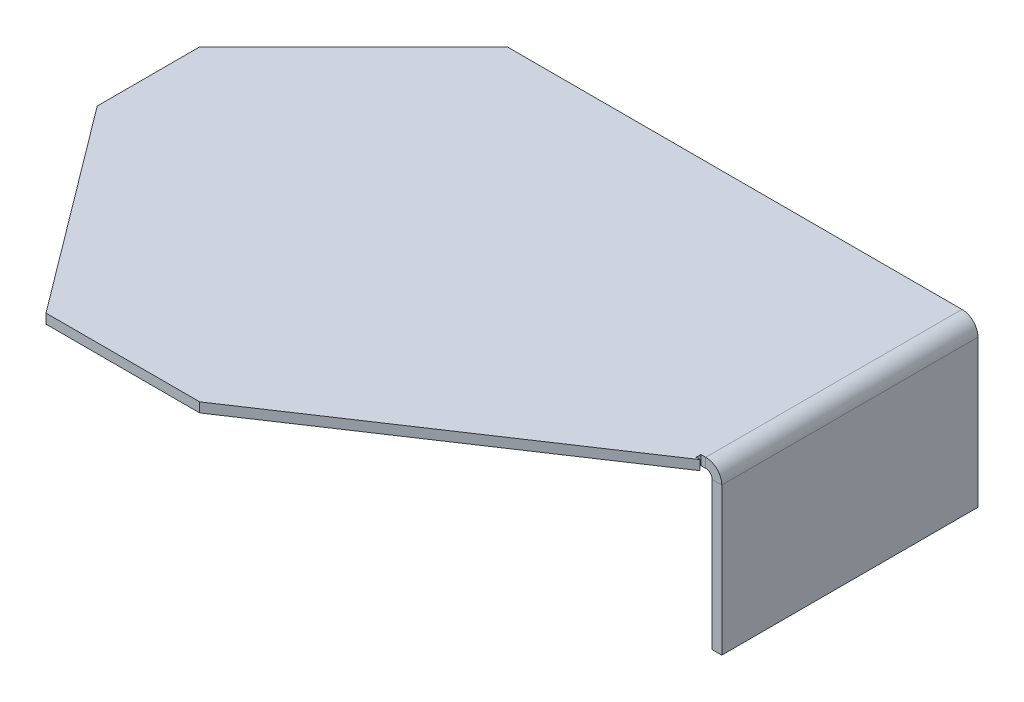
ISO-10303-21;
HEADER;
FILE_DESCRIPTION(('STEP AP214'),'2;1');
FILE_NAME('part.step','',(''),(''),'','','');
FILE_SCHEMA(('AUTOMOTIVE_DESIGN { 1 0 10303 214 1 1 1 1 }'));
ENDSEC;
DATA;
#1=APPLICATION_CONTEXT('core data for automotive mechanical design processes');
#2=APPLICATION_PROTOCOL_DEFINITION('international standard','automotive_design',2000,#1);
#3=PRODUCT_CONTEXT('',#1,'mechanical');
#4=PRODUCT('Part','Part','',(#3));
#5=PRODUCT_RELATED_PRODUCT_CATEGORY('part','',(#4));
#6=PRODUCT_DEFINITION_FORMATION('','',#4);
#7=PRODUCT_DEFINITION_CONTEXT('part definition',#1,'design');
#8=PRODUCT_DEFINITION('design','',#6,#7);
#9=PRODUCT_DEFINITION_SHAPE('','',#8);
#10=(LENGTH_UNIT() NAMED_UNIT(*) SI_UNIT(.MILLI.,.METRE.));
#11=(NAMED_UNIT(*) PLANE_ANGLE_UNIT() SI_UNIT($,.RADIAN.));
#12=(NAMED_UNIT(*) SI_UNIT($,.STERADIAN.) SOLID_ANGLE_UNIT());
#13=UNCERTAINTY_MEASURE_WITH_UNIT(LENGTH_MEASURE(1.E-05),#10,'distance_accuracy_value','');
#14=(GEOMETRIC_REPRESENTATION_CONTEXT(3) GLOBAL_UNCERTAINTY_ASSIGNED_CONTEXT((#13)) GLOBAL_UNIT_ASSIGNED_CONTEXT((#10,
#11,#12)) REPRESENTATION_CONTEXT('',''));
#15=CARTESIAN_POINT('',(0.,0.,0.));
#16=DIRECTION('',(0.,0.,1.));
#17=DIRECTION('',(1.,0.,0.));
#18=AXIS2_PLACEMENT_3D('',#15,#16,#17);
#19=CARTESIAN_POINT('',(1.52655665885959E-12,-9.525,254.));
#20=DIRECTION('',(0.554700196225231,0.,0.832050294337842));
#21=DIRECTION('',(0.832050294337842,0.,-0.554700196225231));
#22=AXIS2_PLACEMENT_3D('',#19,#20,#21);
#23=PLANE('',#22);
#24=DIRECTION('',(0.832050294337842,0.,-0.554700196225231));
#25=VECTOR('',#24,1.);
#26=CARTESIAN_POINT('',(1.52655665885959E-12,-9.525,254.));
#27=LINE('',#26,#25);
#28=CARTESIAN_POINT('',(1.52655665885959E-12,-9.525,254.));
#29=VERTEX_POINT('',#28);
#30=CARTESIAN_POINT('',(297.65625,-9.52500000000002,55.5625));
#31=VERTEX_POINT('',#30);
#32=EDGE_CURVE('E142',#29,#31,#27,.T.);
#33=ORIENTED_EDGE('',*,*,#32,.T.);
#34=DIRECTION('',(0.,1.,0.));
#35=VECTOR('',#34,1.);
#36=CARTESIAN_POINT('',(297.65625,-9.52500000000002,55.5625));
#37=LINE('',#36,#35);
#38=CARTESIAN_POINT('',(297.65625,0.,55.5625));
#39=VERTEX_POINT('',#38);
#40=EDGE_CURVE('E196',#31,#39,#37,.T.);
#41=ORIENTED_EDGE('',*,*,#40,.T.);
#42=DIRECTION('',(0.832050294337842,0.,-0.554700196225231));
#43=VECTOR('',#42,1.);
#44=CARTESIAN_POINT('',(1.52655665885959E-12,0.,254.));
#45=LINE('',#44,#43);
#46=CARTESIAN_POINT('',(1.52655665885959E-12,0.,254.));
#47=VERTEX_POINT('',#46);
#48=EDGE_CURVE('E156',#47,#39,#45,.T.);
#49=ORIENTED_EDGE('',*,*,#48,.F.);
#50=DIRECTION('',(0.,1.,0.));
#51=VECTOR('',#50,1.);
#52=CARTESIAN_POINT('',(1.52655665885959E-12,-9.525,254.));
#53=LINE('',#52,#51);
#54=EDGE_CURVE('E69',#29,#47,#53,.T.);
#55=ORIENTED_EDGE('',*,*,#54,.F.);
#56=EDGE_LOOP('',(#33,#41,#49,#55));
#57=FACE_BOUND('',#56,.T.);
#58=ADVANCED_FACE('F45',(#57),#23,.T.);
#59=CARTESIAN_POINT('',(0.,-9.525,0.));
#60=DIRECTION('',(0.,1.,0.));
#61=DIRECTION('',(0.,0.,1.));
#62=AXIS2_PLACEMENT_3D('',#59,#60,#61);
#63=PLANE('',#62);
#64=DIRECTION('',(-1.,0.,0.));
#65=VECTOR('',#64,1.);
#66=CARTESIAN_POINT('',(297.65625,-9.52500000000002,55.5625));
#67=LINE('',#66,#65);
#68=CARTESIAN_POINT('',(293.6621,-9.52500000000003,55.5625));
#69=VERTEX_POINT('',#68);
#70=EDGE_CURVE('E148',#31,#69,#67,.T.);
#71=ORIENTED_EDGE('',*,*,#70,.F.);
#72=ORIENTED_EDGE('',*,*,#32,.F.);
#73=DIRECTION('',(1.,0.,0.));
#74=VECTOR('',#73,1.);
#75=CARTESIAN_POINT('',(-152.399999999998,-9.525,254.));
#76=LINE('',#75,#74);
#77=CARTESIAN_POINT('',(-152.399999999998,-9.525,254.));
#78=VERTEX_POINT('',#77);
#79=EDGE_CURVE('E132',#78,#29,#76,.T.);
#80=ORIENTED_EDGE('',*,*,#79,.F.);
#81=DIRECTION('',(0.600000000000004,0.,0.799999999999997));
#82=VECTOR('',#81,1.);
#83=CARTESIAN_POINT('',(-304.8,-9.525,50.8));
#84=LINE('',#83,#82);
#85=CARTESIAN_POINT('',(-304.8,-9.525,50.8));
#86=VERTEX_POINT('',#85);
#87=EDGE_CURVE('E113',#86,#78,#84,.T.);
#88=ORIENTED_EDGE('',*,*,#87,.F.);
#89=DIRECTION('',(0.,0.,1.));
#90=VECTOR('',#89,1.);
#91=CARTESIAN_POINT('',(-304.8,-9.525,50.8));
#92=LINE('',#91,#90);
#93=CARTESIAN_POINT('',(-304.8,-9.525,-50.8));
#94=VERTEX_POINT('',#93);
#95=EDGE_CURVE('E129',#94,#86,#92,.T.);
#96=ORIENTED_EDGE('',*,*,#95,.F.);
#97=DIRECTION('',(-0.707106781186551,0.,0.707106781186544));
#98=VECTOR('',#97,1.);
#99=CARTESIAN_POINT('',(-152.399999999998,-9.525,-203.2));
#100=LINE('',#99,#98);
#101=CARTESIAN_POINT('',(-152.399999999998,-9.525,-203.2));
#102=VERTEX_POINT('',#101);
#103=EDGE_CURVE('E136',#102,#94,#100,.T.);
#104=ORIENTED_EDGE('',*,*,#103,.F.);
#105=DIRECTION('',(-1.,0.,0.));
#106=VECTOR('',#105,1.);
#107=CARTESIAN_POINT('',(304.8,-9.525,-203.2));
#108=LINE('',#107,#106);
#109=CARTESIAN_POINT('',(298.4246,-9.52500000000003,-203.2));
#110=VERTEX_POINT('',#109);
#111=EDGE_CURVE('E100',#110,#102,#108,.T.);
#112=ORIENTED_EDGE('',*,*,#111,.F.);
#113=DIRECTION('',(0.,0.,1.));
#114=VECTOR('',#113,1.);
#115=CARTESIAN_POINT('',(298.4246,-9.52500000000003,50.8));
#116=LINE('',#115,#114);
#117=CARTESIAN_POINT('',(298.4246,-9.52500000000003,50.8));
#118=VERTEX_POINT('',#117);
#119=EDGE_CURVE('E212',#118,#110,#116,.F.);
#120=ORIENTED_EDGE('',*,*,#119,.F.);
#121=DIRECTION('',(1.,0.,0.));
#122=VECTOR('',#121,1.);
#123=CARTESIAN_POINT('',(293.6621,-9.52500000000003,50.8));
#124=LINE('',#123,#122);
#125=CARTESIAN_POINT('',(293.6621,-9.52500000000003,50.8));
#126=VERTEX_POINT('',#125);
#127=EDGE_CURVE('E194',#126,#118,#124,.T.);
#128=ORIENTED_EDGE('',*,*,#127,.F.);
#129=DIRECTION('',(0.,0.,-1.));
#130=VECTOR('',#129,1.);
#131=CARTESIAN_POINT('',(293.6621,-9.52500000000003,55.5625));
#132=LINE('',#131,#130);
#133=EDGE_CURVE('E193',#69,#126,#132,.T.);
#134=ORIENTED_EDGE('',*,*,#133,.F.);
#135=EDGE_LOOP('',(#71,#72,#80,#88,#96,#104,#112,#120,#128,#134));
#136=FACE_BOUND('',#135,.T.);
#137=ADVANCED_FACE('F127',(#136),#63,.F.);
#138=CARTESIAN_POINT('',(0.,0.,0.));
#139=DIRECTION('',(0.,1.,0.));
#140=DIRECTION('',(0.,0.,1.));
#141=AXIS2_PLACEMENT_3D('',#138,#139,#140);
#142=PLANE('',#141);
#143=ORIENTED_EDGE('',*,*,#48,.T.);
#144=DIRECTION('',(-1.,0.,0.));
#145=VECTOR('',#144,1.);
#146=CARTESIAN_POINT('',(5.79160460977968E-13,0.,55.5625000000031));
#147=LINE('',#146,#145);
#148=CARTESIAN_POINT('',(293.6621,0.,55.5625));
#149=VERTEX_POINT('',#148);
#150=EDGE_CURVE('E11',#39,#149,#147,.T.);
#151=ORIENTED_EDGE('',*,*,#150,.T.);
#152=DIRECTION('',(0.,0.,-1.));
#153=VECTOR('',#152,1.);
#154=CARTESIAN_POINT('',(293.6621,0.,0.));
#155=LINE('',#154,#153);
#156=CARTESIAN_POINT('',(293.6621,0.,50.8));
#157=VERTEX_POINT('',#156);
#158=EDGE_CURVE('E53',#149,#157,#155,.T.);
#159=ORIENTED_EDGE('',*,*,#158,.T.);
#160=DIRECTION('',(1.,0.,0.));
#161=VECTOR('',#160,1.);
#162=CARTESIAN_POINT('',(0.,0.,50.8));
#163=LINE('',#162,#161);
#164=CARTESIAN_POINT('',(298.4246,0.,50.8));
#165=VERTEX_POINT('',#164);
#166=EDGE_CURVE('E160',#157,#165,#163,.T.);
#167=ORIENTED_EDGE('',*,*,#166,.T.);
#168=DIRECTION('',(0.,0.,1.));
#169=VECTOR('',#168,1.);
#170=CARTESIAN_POINT('',(298.4246,0.,50.8));
#171=LINE('',#170,#169);
#172=CARTESIAN_POINT('',(298.4246,0.,-203.2));
#173=VERTEX_POINT('',#172);
#174=EDGE_CURVE('E222',#165,#173,#171,.F.);
#175=ORIENTED_EDGE('',*,*,#174,.T.);
#176=DIRECTION('',(-1.,0.,0.));
#177=VECTOR('',#176,1.);
#178=CARTESIAN_POINT('',(304.8,0.,-203.2));
#179=LINE('',#178,#177);
#180=CARTESIAN_POINT('',(-152.399999999998,0.,-203.2));
#181=VERTEX_POINT('',#180);
#182=EDGE_CURVE('E145',#173,#181,#179,.T.);
#183=ORIENTED_EDGE('',*,*,#182,.T.);
#184=DIRECTION('',(-0.707106781186551,0.,0.707106781186544));
#185=VECTOR('',#184,1.);
#186=CARTESIAN_POINT('',(-152.399999999998,0.,-203.2));
#187=LINE('',#186,#185);
#188=CARTESIAN_POINT('',(-304.8,0.,-50.8));
#189=VERTEX_POINT('',#188);
#190=EDGE_CURVE('E147',#181,#189,#187,.T.);
#191=ORIENTED_EDGE('',*,*,#190,.T.);
#192=DIRECTION('',(0.,0.,1.));
#193=VECTOR('',#192,1.);
#194=CARTESIAN_POINT('',(-304.8,0.,50.8));
#195=LINE('',#194,#193);
#196=CARTESIAN_POINT('',(-304.8,0.,50.8));
#197=VERTEX_POINT('',#196);
#198=EDGE_CURVE('E151',#189,#197,#195,.T.);
#199=ORIENTED_EDGE('',*,*,#198,.T.);
#200=DIRECTION('',(0.600000000000004,0.,0.799999999999997));
#201=VECTOR('',#200,1.);
#202=CARTESIAN_POINT('',(-304.8,0.,50.8));
#203=LINE('',#202,#201);
#204=CARTESIAN_POINT('',(-152.399999999998,0.,254.));
#205=VERTEX_POINT('',#204);
#206=EDGE_CURVE('E115',#197,#205,#203,.T.);
#207=ORIENTED_EDGE('',*,*,#206,.T.);
#208=DIRECTION('',(1.,0.,0.));
#209=VECTOR('',#208,1.);
#210=CARTESIAN_POINT('',(-152.399999999998,0.,254.));
#211=LINE('',#210,#209);
#212=EDGE_CURVE('E154',#205,#47,#211,.T.);
#213=ORIENTED_EDGE('',*,*,#212,.T.);
#214=EDGE_LOOP('',(#143,#151,#159,#167,#175,#183,#191,#199,#207,#213));
#215=FACE_BOUND('',#214,.T.);
#216=ADVANCED_FACE('F169',(#215),#142,.T.);
#217=CARTESIAN_POINT('',(-152.399999999998,-9.525,254.));
#218=DIRECTION('',(0.,0.,1.));
#219=DIRECTION('',(1.,0.,0.));
#220=AXIS2_PLACEMENT_3D('',#217,#218,#219);
#221=PLANE('',#220);
#222=ORIENTED_EDGE('',*,*,#212,.F.);
#223=DIRECTION('',(0.,1.,0.));
#224=VECTOR('',#223,1.);
#225=CARTESIAN_POINT('',(-152.399999999998,-9.525,254.));
#226=LINE('',#225,#224);
#227=EDGE_CURVE('E120',#78,#205,#226,.T.);
#228=ORIENTED_EDGE('',*,*,#227,.F.);
#229=ORIENTED_EDGE('',*,*,#79,.T.);
#230=ORIENTED_EDGE('',*,*,#54,.T.);
#231=EDGE_LOOP('',(#222,#228,#229,#230));
#232=FACE_BOUND('',#231,.T.);
#233=ADVANCED_FACE('F337',(#232),#221,.T.);
#234=CARTESIAN_POINT('',(-304.8,-9.525,50.8));
#235=DIRECTION('',(-0.799999999999997,0.,0.600000000000004));
#236=DIRECTION('',(0.600000000000004,0.,0.799999999999997));
#237=AXIS2_PLACEMENT_3D('',#234,#235,#236);
#238=PLANE('',#237);
#239=ORIENTED_EDGE('',*,*,#206,.F.);
#240=DIRECTION('',(0.,1.,0.));
#241=VECTOR('',#240,1.);
#242=CARTESIAN_POINT('',(-304.8,-9.525,50.8));
#243=LINE('',#242,#241);
#244=EDGE_CURVE('E110',#86,#197,#243,.T.);
#245=ORIENTED_EDGE('',*,*,#244,.F.);
#246=ORIENTED_EDGE('',*,*,#87,.T.);
#247=ORIENTED_EDGE('',*,*,#227,.T.);
#248=EDGE_LOOP('',(#239,#245,#246,#247));
#249=FACE_BOUND('',#248,.T.);
#250=ADVANCED_FACE('F112',(#249),#238,.T.);
#251=CARTESIAN_POINT('',(-304.8,-9.525,50.8));
#252=DIRECTION('',(-1.,0.,0.));
#253=DIRECTION('',(0.,0.,1.));
#254=AXIS2_PLACEMENT_3D('',#251,#252,#253);
#255=PLANE('',#254);
#256=ORIENTED_EDGE('',*,*,#198,.F.);
#257=DIRECTION('',(0.,1.,0.));
#258=VECTOR('',#257,1.);
#259=CARTESIAN_POINT('',(-304.8,-9.525,-50.8));
#260=LINE('',#259,#258);
#261=EDGE_CURVE('E121',#94,#189,#260,.T.);
#262=ORIENTED_EDGE('',*,*,#261,.F.);
#263=ORIENTED_EDGE('',*,*,#95,.T.);
#264=ORIENTED_EDGE('',*,*,#244,.T.);
#265=EDGE_LOOP('',(#256,#262,#263,#264));
#266=FACE_BOUND('',#265,.T.);
#267=ADVANCED_FACE('F135',(#266),#255,.T.);
#268=CARTESIAN_POINT('',(-152.399999999998,-9.525,-203.2));
#269=DIRECTION('',(-0.707106781186544,0.,-0.707106781186551));
#270=DIRECTION('',(-0.707106781186551,0.,0.707106781186544));
#271=AXIS2_PLACEMENT_3D('',#268,#269,#270);
#272=PLANE('',#271);
#273=ORIENTED_EDGE('',*,*,#190,.F.);
#274=DIRECTION('',(0.,1.,0.));
#275=VECTOR('',#274,1.);
#276=CARTESIAN_POINT('',(-152.399999999998,-9.525,-203.2));
#277=LINE('',#276,#275);
#278=EDGE_CURVE('E144',#102,#181,#277,.T.);
#279=ORIENTED_EDGE('',*,*,#278,.F.);
#280=ORIENTED_EDGE('',*,*,#103,.T.);
#281=ORIENTED_EDGE('',*,*,#261,.T.);
#282=EDGE_LOOP('',(#273,#279,#280,#281));
#283=FACE_BOUND('',#282,.T.);
#284=ADVANCED_FACE('F343',(#283),#272,.T.);
#285=CARTESIAN_POINT('',(304.8,-9.525,-203.2));
#286=DIRECTION('',(0.,0.,-1.));
#287=DIRECTION('',(-1.,0.,0.));
#288=AXIS2_PLACEMENT_3D('',#285,#286,#287);
#289=PLANE('',#288);
#290=DIRECTION('',(0.,1.,0.));
#291=VECTOR('',#290,1.);
#292=CARTESIAN_POINT('',(298.4246,-9.52500000000003,-203.2));
#293=LINE('',#292,#291);
#294=EDGE_CURVE('E207',#110,#173,#293,.T.);
#295=ORIENTED_EDGE('',*,*,#294,.F.);
#296=ORIENTED_EDGE('',*,*,#111,.T.);
#297=ORIENTED_EDGE('',*,*,#278,.T.);
#298=ORIENTED_EDGE('',*,*,#182,.F.);
#299=EDGE_LOOP('',(#295,#296,#297,#298));
#300=FACE_BOUND('',#299,.T.);
#301=ADVANCED_FACE('F47',(#300),#289,.T.);
#302=CARTESIAN_POINT('',(297.65625,-9.52500000000002,55.5625));
#303=DIRECTION('',(0.,0.,-1.));
#304=DIRECTION('',(-1.,0.,0.));
#305=AXIS2_PLACEMENT_3D('',#302,#303,#304);
#306=PLANE('',#305);
#307=ORIENTED_EDGE('',*,*,#150,.F.);
#308=ORIENTED_EDGE('',*,*,#40,.F.);
#309=ORIENTED_EDGE('',*,*,#70,.T.);
#310=DIRECTION('',(0.,1.,0.));
#311=VECTOR('',#310,1.);
#312=CARTESIAN_POINT('',(293.6621,-9.52500000000003,55.5625));
#313=LINE('',#312,#311);
#314=EDGE_CURVE('E184',#69,#149,#313,.T.);
#315=ORIENTED_EDGE('',*,*,#314,.T.);
#316=EDGE_LOOP('',(#307,#308,#309,#315));
#317=FACE_BOUND('',#316,.T.);
#318=ADVANCED_FACE('F189',(#317),#306,.T.);
#319=CARTESIAN_POINT('',(293.6621,-9.52500000000003,55.5625));
#320=DIRECTION('',(1.,0.,0.));
#321=DIRECTION('',(0.,0.,-1.));
#322=AXIS2_PLACEMENT_3D('',#319,#320,#321);
#323=PLANE('',#322);
#324=ORIENTED_EDGE('',*,*,#158,.F.);
#325=ORIENTED_EDGE('',*,*,#314,.F.);
#326=ORIENTED_EDGE('',*,*,#133,.T.);
#327=DIRECTION('',(0.,1.,0.));
#328=VECTOR('',#327,1.);
#329=CARTESIAN_POINT('',(293.6621,-9.52500000000003,50.8));
#330=LINE('',#329,#328);
#331=EDGE_CURVE('E187',#126,#157,#330,.T.);
#332=ORIENTED_EDGE('',*,*,#331,.T.);
#333=EDGE_LOOP('',(#324,#325,#326,#332));
#334=FACE_BOUND('',#333,.T.);
#335=ADVANCED_FACE('F181',(#334),#323,.T.);
#336=CARTESIAN_POINT('',(293.6621,-9.52500000000003,50.8));
#337=DIRECTION('',(0.,0.,1.));
#338=DIRECTION('',(0.,-1.,0.));
#339=AXIS2_PLACEMENT_3D('',#336,#337,#338);
#340=PLANE('',#339);
#341=ORIENTED_EDGE('',*,*,#166,.F.);
#342=ORIENTED_EDGE('',*,*,#331,.F.);
#343=ORIENTED_EDGE('',*,*,#127,.T.);
#344=DIRECTION('',(0.,1.,0.));
#345=VECTOR('',#344,1.);
#346=CARTESIAN_POINT('',(298.4246,-9.52500000000003,50.8));
#347=LINE('',#346,#345);
#348=EDGE_CURVE('E204',#118,#165,#347,.T.);
#349=ORIENTED_EDGE('',*,*,#348,.T.);
#350=EDGE_LOOP('',(#341,#342,#343,#349));
#351=FACE_BOUND('',#350,.T.);
#352=ADVANCED_FACE('F312',(#351),#340,.T.);
#353=CARTESIAN_POINT('',(298.4246,-15.9004,-203.2));
#354=DIRECTION('',(0.,0.,-1.));
#355=DIRECTION('',(-1.,0.,0.));
#356=AXIS2_PLACEMENT_3D('',#353,#354,#355);
#357=PLANE('',#356);
#358=DIRECTION('',(1.,0.,0.));
#359=VECTOR('',#358,1.);
#360=CARTESIAN_POINT('',(304.8,-15.9004,-203.2));
#361=LINE('',#360,#359);
#362=CARTESIAN_POINT('',(304.8,-15.9004,-203.2));
#363=VERTEX_POINT('',#362);
#364=CARTESIAN_POINT('',(314.325,-15.9003999999999,-203.2));
#365=VERTEX_POINT('',#364);
#366=EDGE_CURVE('E251',#363,#365,#361,.T.);
#367=ORIENTED_EDGE('',*,*,#366,.F.);
#368=CARTESIAN_POINT('',(298.4246,-15.9004,-203.2));
#369=DIRECTION('',(0.,0.,1.));
#370=DIRECTION('',(1.,0.,0.));
#371=AXIS2_PLACEMENT_3D('',#368,#369,#370);
#372=CIRCLE('',#371,6.37539999999998);
#373=EDGE_CURVE('E216',#110,#363,#372,.F.);
#374=ORIENTED_EDGE('',*,*,#373,.F.);
#375=ORIENTED_EDGE('',*,*,#294,.T.);
#376=CARTESIAN_POINT('',(298.4246,-15.9004,-203.2));
#377=DIRECTION('',(0.,0.,1.));
#378=DIRECTION('',(1.,0.,0.));
#379=AXIS2_PLACEMENT_3D('',#376,#377,#378);
#380=CIRCLE('',#379,15.9004);
#381=EDGE_CURVE('E60',#173,#365,#380,.F.);
#382=ORIENTED_EDGE('',*,*,#381,.T.);
#383=EDGE_LOOP('',(#367,#374,#375,#382));
#384=FACE_BOUND('',#383,.T.);
#385=ADVANCED_FACE('F316',(#384),#357,.T.);
#386=CARTESIAN_POINT('',(298.4246,-15.9004,50.8));
#387=DIRECTION('',(0.,0.,-1.));
#388=DIRECTION('',(-1.,0.,0.));
#389=AXIS2_PLACEMENT_3D('',#386,#387,#388);
#390=PLANE('',#389);
#391=CARTESIAN_POINT('',(298.4246,-15.9004,50.8));
#392=DIRECTION('',(0.,0.,1.));
#393=DIRECTION('',(1.,0.,0.));
#394=AXIS2_PLACEMENT_3D('',#391,#392,#393);
#395=CIRCLE('',#394,6.37539999999998);
#396=CARTESIAN_POINT('',(304.8,-15.9004,50.8));
#397=VERTEX_POINT('',#396);
#398=EDGE_CURVE('E209',#397,#118,#395,.T.);
#399=ORIENTED_EDGE('',*,*,#398,.F.);
#400=DIRECTION('',(1.,0.,0.));
#401=VECTOR('',#400,1.);
#402=CARTESIAN_POINT('',(304.8,-15.9004,50.8));
#403=LINE('',#402,#401);
#404=CARTESIAN_POINT('',(314.325,-15.9003999999999,50.8));
#405=VERTEX_POINT('',#404);
#406=EDGE_CURVE('E250',#397,#405,#403,.T.);
#407=ORIENTED_EDGE('',*,*,#406,.T.);
#408=CARTESIAN_POINT('',(298.4246,-15.9004,50.8));
#409=DIRECTION('',(0.,0.,1.));
#410=DIRECTION('',(1.,0.,0.));
#411=AXIS2_PLACEMENT_3D('',#408,#409,#410);
#412=CIRCLE('',#411,15.9004);
#413=EDGE_CURVE('E219',#405,#165,#412,.T.);
#414=ORIENTED_EDGE('',*,*,#413,.T.);
#415=ORIENTED_EDGE('',*,*,#348,.F.);
#416=EDGE_LOOP('',(#399,#407,#414,#415));
#417=FACE_BOUND('',#416,.T.);
#418=ADVANCED_FACE('F273',(#417),#390,.F.);
#419=CARTESIAN_POINT('',(298.4246,-15.9004,50.8));
#420=DIRECTION('',(0.,0.,1.));
#421=DIRECTION('',(1.,0.,0.));
#422=AXIS2_PLACEMENT_3D('',#419,#420,#421);
#423=CYLINDRICAL_SURFACE('',#422,15.9004);
#424=ORIENTED_EDGE('',*,*,#174,.F.);
#425=ORIENTED_EDGE('',*,*,#413,.F.);
#426=DIRECTION('',(0.,0.,-1.));
#427=VECTOR('',#426,1.);
#428=CARTESIAN_POINT('',(314.325,-15.9003999999999,0.));
#429=LINE('',#428,#427);
#430=EDGE_CURVE('E241',#405,#365,#429,.T.);
#431=ORIENTED_EDGE('',*,*,#430,.T.);
#432=ORIENTED_EDGE('',*,*,#381,.F.);
#433=EDGE_LOOP('',(#424,#425,#431,#432));
#434=FACE_BOUND('',#433,.T.);
#435=ADVANCED_FACE('F319',(#434),#423,.T.);
#436=CARTESIAN_POINT('',(298.4246,-15.9004,50.8));
#437=DIRECTION('',(0.,0.,1.));
#438=DIRECTION('',(1.,0.,0.));
#439=AXIS2_PLACEMENT_3D('',#436,#437,#438);
#440=CYLINDRICAL_SURFACE('',#439,6.37539999999998);
#441=ORIENTED_EDGE('',*,*,#119,.T.);
#442=ORIENTED_EDGE('',*,*,#373,.T.);
#443=DIRECTION('',(0.,0.,1.));
#444=VECTOR('',#443,1.);
#445=CARTESIAN_POINT('',(304.8,-15.9004,-203.2));
#446=LINE('',#445,#444);
#447=EDGE_CURVE('E254',#363,#397,#446,.T.);
#448=ORIENTED_EDGE('',*,*,#447,.T.);
#449=ORIENTED_EDGE('',*,*,#398,.T.);
#450=EDGE_LOOP('',(#441,#442,#448,#449));
#451=FACE_BOUND('',#450,.T.);
#452=ADVANCED_FACE('F262',(#451),#440,.F.);
#453=CARTESIAN_POINT('',(314.325000000001,-161.925,50.8));
#454=DIRECTION('',(0.,0.,-1.));
#455=DIRECTION('',(-1.,0.,0.));
#456=AXIS2_PLACEMENT_3D('',#453,#454,#455);
#457=PLANE('',#456);
#458=ORIENTED_EDGE('',*,*,#406,.F.);
#459=DIRECTION('',(0.,-1.,0.));
#460=VECTOR('',#459,1.);
#461=CARTESIAN_POINT('',(304.800000000001,-161.925,50.8));
#462=LINE('',#461,#460);
#463=CARTESIAN_POINT('',(304.800000000001,-161.925,50.8));
#464=VERTEX_POINT('',#463);
#465=EDGE_CURVE('E238',#397,#464,#462,.T.);
#466=ORIENTED_EDGE('',*,*,#465,.T.);
#467=DIRECTION('',(-1.,0.,0.));
#468=VECTOR('',#467,1.);
#469=CARTESIAN_POINT('',(314.325000000001,-161.925,50.8));
#470=LINE('',#469,#468);
#471=CARTESIAN_POINT('',(314.325000000001,-161.925,50.8));
#472=VERTEX_POINT('',#471);
#473=EDGE_CURVE('E213',#472,#464,#470,.T.);
#474=ORIENTED_EDGE('',*,*,#473,.F.);
#475=DIRECTION('',(0.,-1.,0.));
#476=VECTOR('',#475,1.);
#477=CARTESIAN_POINT('',(314.325000000001,-161.925,50.8));
#478=LINE('',#477,#476);
#479=EDGE_CURVE('E234',#405,#472,#478,.T.);
#480=ORIENTED_EDGE('',*,*,#479,.F.);
#481=EDGE_LOOP('',(#458,#466,#474,#480));
#482=FACE_BOUND('',#481,.T.);
#483=ADVANCED_FACE('F278',(#482),#457,.F.);
#484=CARTESIAN_POINT('',(314.325,-9.52499999999997,-203.2));
#485=DIRECTION('',(0.,0.,1.));
#486=DIRECTION('',(1.,0.,0.));
#487=AXIS2_PLACEMENT_3D('',#484,#485,#486);
#488=PLANE('',#487);
#489=ORIENTED_EDGE('',*,*,#366,.T.);
#490=DIRECTION('',(0.,1.,0.));
#491=VECTOR('',#490,1.);
#492=CARTESIAN_POINT('',(314.325,-9.52499999999997,-203.2));
#493=LINE('',#492,#491);
#494=CARTESIAN_POINT('',(314.325,-161.925,-203.2));
#495=VERTEX_POINT('',#494);
#496=EDGE_CURVE('E230',#495,#365,#493,.T.);
#497=ORIENTED_EDGE('',*,*,#496,.F.);
#498=DIRECTION('',(-1.,0.,0.));
#499=VECTOR('',#498,1.);
#500=CARTESIAN_POINT('',(314.325,-161.925,-203.2));
#501=LINE('',#500,#499);
#502=CARTESIAN_POINT('',(304.8,-161.925,-203.2));
#503=VERTEX_POINT('',#502);
#504=EDGE_CURVE('E227',#495,#503,#501,.T.);
#505=ORIENTED_EDGE('',*,*,#504,.T.);
#506=DIRECTION('',(0.,1.,0.));
#507=VECTOR('',#506,1.);
#508=CARTESIAN_POINT('',(304.8,-9.525,-203.2));
#509=LINE('',#508,#507);
#510=EDGE_CURVE('E231',#503,#363,#509,.T.);
#511=ORIENTED_EDGE('',*,*,#510,.T.);
#512=EDGE_LOOP('',(#489,#497,#505,#511));
#513=FACE_BOUND('',#512,.T.);
#514=ADVANCED_FACE('F294',(#513),#488,.F.);
#515=CARTESIAN_POINT('',(314.325,1.14347938437764E-12,0.));
#516=DIRECTION('',(-1.,0.,0.));
#517=DIRECTION('',(0.,-1.,0.));
#518=AXIS2_PLACEMENT_3D('',#515,#516,#517);
#519=PLANE('',#518);
#520=ORIENTED_EDGE('',*,*,#430,.F.);
#521=ORIENTED_EDGE('',*,*,#479,.T.);
#522=DIRECTION('',(0.,0.,-1.));
#523=VECTOR('',#522,1.);
#524=CARTESIAN_POINT('',(314.325,-161.925,-203.2));
#525=LINE('',#524,#523);
#526=EDGE_CURVE('E244',#472,#495,#525,.T.);
#527=ORIENTED_EDGE('',*,*,#526,.T.);
#528=ORIENTED_EDGE('',*,*,#496,.T.);
#529=EDGE_LOOP('',(#520,#521,#527,#528));
#530=FACE_BOUND('',#529,.T.);
#531=ADVANCED_FACE('F299',(#530),#519,.F.);
#532=CARTESIAN_POINT('',(304.8,1.11022302462516E-12,0.));
#533=DIRECTION('',(-1.,0.,0.));
#534=DIRECTION('',(0.,-1.,0.));
#535=AXIS2_PLACEMENT_3D('',#532,#533,#534);
#536=PLANE('',#535);
#537=ORIENTED_EDGE('',*,*,#465,.F.);
#538=ORIENTED_EDGE('',*,*,#447,.F.);
#539=ORIENTED_EDGE('',*,*,#510,.F.);
#540=DIRECTION('',(0.,0.,-1.));
#541=VECTOR('',#540,1.);
#542=CARTESIAN_POINT('',(304.8,-161.925,-203.2));
#543=LINE('',#542,#541);
#544=EDGE_CURVE('E235',#464,#503,#543,.T.);
#545=ORIENTED_EDGE('',*,*,#544,.F.);
#546=EDGE_LOOP('',(#537,#538,#539,#545));
#547=FACE_BOUND('',#546,.T.);
#548=ADVANCED_FACE('F282',(#547),#536,.T.);
#549=CARTESIAN_POINT('',(314.325,-161.925,-203.2));
#550=DIRECTION('',(0.,1.,0.));
#551=DIRECTION('',(-1.,0.,0.));
#552=AXIS2_PLACEMENT_3D('',#549,#550,#551);
#553=PLANE('',#552);
#554=ORIENTED_EDGE('',*,*,#544,.T.);
#555=ORIENTED_EDGE('',*,*,#504,.F.);
#556=ORIENTED_EDGE('',*,*,#526,.F.);
#557=ORIENTED_EDGE('',*,*,#473,.T.);
#558=EDGE_LOOP('',(#554,#555,#556,#557));
#559=FACE_BOUND('',#558,.T.);
#560=ADVANCED_FACE('F287',(#559),#553,.F.);
#561=CLOSED_SHELL('',(#58,#137,#216,#233,#250,#267,#284,#301,#318,#335,#352,#385,#418,#435,#452,
#483,#514,#531,#548,#560));
#562=MANIFOLD_SOLID_BREP('B2',#561);
#563=ADVANCED_BREP_SHAPE_REPRESENTATION('',(#18,#562),#14);
#564=SHAPE_DEFINITION_REPRESENTATION(#9,#563);
ENDSEC;
END-ISO-10303-21;
